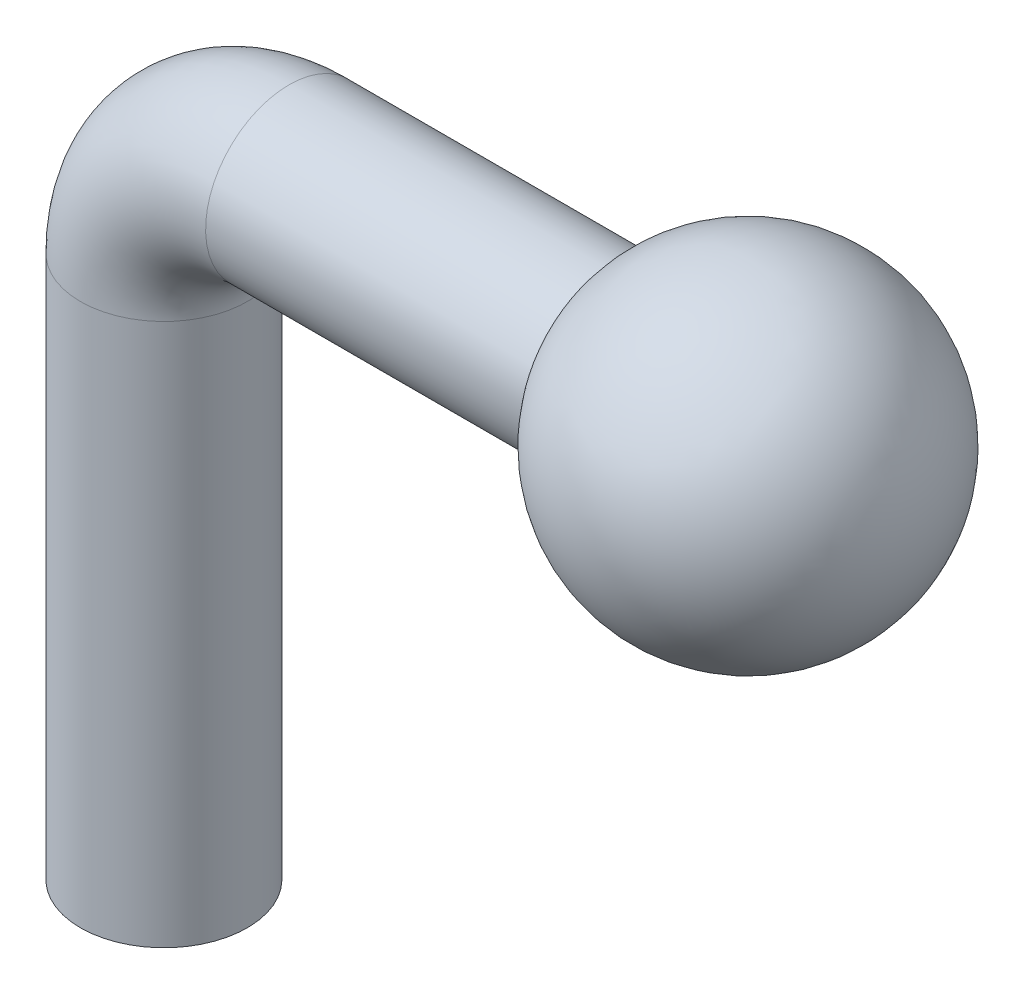
ISO-10303-21;
HEADER;
FILE_DESCRIPTION(('STEP AP214'),'2;1');
FILE_NAME('part.step','',(''),(''),'','','');
FILE_SCHEMA(('AUTOMOTIVE_DESIGN { 1 0 10303 214 1 1 1 1 }'));
ENDSEC;
DATA;
#1=APPLICATION_CONTEXT('core data for automotive mechanical design processes');
#2=APPLICATION_PROTOCOL_DEFINITION('international standard','automotive_design',2000,#1);
#3=PRODUCT_CONTEXT('',#1,'mechanical');
#4=PRODUCT('Part','Part','',(#3));
#5=PRODUCT_RELATED_PRODUCT_CATEGORY('part','',(#4));
#6=PRODUCT_DEFINITION_FORMATION('','',#4);
#7=PRODUCT_DEFINITION_CONTEXT('part definition',#1,'design');
#8=PRODUCT_DEFINITION('design','',#6,#7);
#9=PRODUCT_DEFINITION_SHAPE('','',#8);
#10=(LENGTH_UNIT() NAMED_UNIT(*) SI_UNIT(.MILLI.,.METRE.));
#11=(NAMED_UNIT(*) PLANE_ANGLE_UNIT() SI_UNIT($,.RADIAN.));
#12=(NAMED_UNIT(*) SI_UNIT($,.STERADIAN.) SOLID_ANGLE_UNIT());
#13=UNCERTAINTY_MEASURE_WITH_UNIT(LENGTH_MEASURE(1.E-05),#10,'distance_accuracy_value','');
#14=(GEOMETRIC_REPRESENTATION_CONTEXT(3) GLOBAL_UNCERTAINTY_ASSIGNED_CONTEXT((#13)) GLOBAL_UNIT_ASSIGNED_CONTEXT((#10,
#11,#12)) REPRESENTATION_CONTEXT('',''));
#15=CARTESIAN_POINT('',(0.,0.,0.));
#16=DIRECTION('',(0.,0.,1.));
#17=DIRECTION('',(1.,0.,0.));
#18=AXIS2_PLACEMENT_3D('',#15,#16,#17);
#19=CARTESIAN_POINT('',(3.00000000000002,16.,0.));
#20=DIRECTION('',(1.,0.,0.));
#21=DIRECTION('',(0.,0.,-1.));
#22=AXIS2_PLACEMENT_3D('',#19,#20,#21);
#23=CYLINDRICAL_SURFACE('',#22,2.);
#24=CARTESIAN_POINT('',(3.00000000000002,16.,0.));
#25=DIRECTION('',(1.,0.,0.));
#26=DIRECTION('',(0.,0.,1.));
#27=AXIS2_PLACEMENT_3D('',#24,#25,#26);
#28=CIRCLE('',#27,2.);
#29=CARTESIAN_POINT('',(3.00000000000004,18.,0.));
#30=VERTEX_POINT('',#29);
#31=EDGE_CURVE('E10',#30,#30,#28,.T.);
#32=ORIENTED_EDGE('',*,*,#31,.T.);
#33=EDGE_LOOP('',(#32));
#34=FACE_BOUND('',#33,.T.);
#35=CARTESIAN_POINT('',(10.6518661914434,16.,0.));
#36=DIRECTION('',(1.,0.,0.));
#37=DIRECTION('',(0.,0.,-1.));
#38=AXIS2_PLACEMENT_3D('',#35,#36,#37);
#39=CIRCLE('',#38,2.);
#40=CARTESIAN_POINT('',(10.6518661914434,16.,-2.));
#41=VERTEX_POINT('',#40);
#42=EDGE_CURVE('E49',#41,#41,#39,.F.);
#43=ORIENTED_EDGE('',*,*,#42,.T.);
#44=EDGE_LOOP('',(#43));
#45=FACE_BOUND('',#44,.T.);
#46=ADVANCED_FACE('F45',(#34,#45),#23,.T.);
#47=CARTESIAN_POINT('',(0.,0.,0.));
#48=DIRECTION('',(0.,1.,0.));
#49=DIRECTION('',(0.,0.,1.));
#50=AXIS2_PLACEMENT_3D('',#47,#48,#49);
#51=PLANE('',#50);
#52=CARTESIAN_POINT('',(0.,0.,0.));
#53=DIRECTION('',(0.,1.,0.));
#54=DIRECTION('',(0.,0.,1.));
#55=AXIS2_PLACEMENT_3D('',#52,#53,#54);
#56=CIRCLE('',#55,2.);
#57=CARTESIAN_POINT('',(0.,0.,2.));
#58=VERTEX_POINT('',#57);
#59=EDGE_CURVE('E59',#58,#58,#56,.T.);
#60=ORIENTED_EDGE('',*,*,#59,.F.);
#61=EDGE_LOOP('',(#60));
#62=FACE_BOUND('',#61,.T.);
#63=ADVANCED_FACE('F47',(#62),#51,.F.);
#64=CARTESIAN_POINT('',(0.,0.,0.));
#65=DIRECTION('',(0.,1.,0.));
#66=DIRECTION('',(0.,0.,1.));
#67=AXIS2_PLACEMENT_3D('',#64,#65,#66);
#68=CYLINDRICAL_SURFACE('',#67,2.);
#69=CARTESIAN_POINT('',(0.,13.,0.));
#70=DIRECTION('',(0.,1.,0.));
#71=DIRECTION('',(0.,0.,1.));
#72=AXIS2_PLACEMENT_3D('',#69,#70,#71);
#73=CIRCLE('',#72,2.);
#74=CARTESIAN_POINT('',(-2.,13.,0.));
#75=VERTEX_POINT('',#74);
#76=EDGE_CURVE('E54',#75,#75,#73,.T.);
#77=ORIENTED_EDGE('',*,*,#76,.F.);
#78=EDGE_LOOP('',(#77));
#79=FACE_BOUND('',#78,.T.);
#80=ORIENTED_EDGE('',*,*,#59,.T.);
#81=EDGE_LOOP('',(#80));
#82=FACE_BOUND('',#81,.T.);
#83=ADVANCED_FACE('F79',(#79,#82),#68,.T.);
#84=CARTESIAN_POINT('',(3.,13.,0.));
#85=DIRECTION('',(0.,0.,-1.));
#86=DIRECTION('',(-1.,0.,0.));
#87=AXIS2_PLACEMENT_3D('',#84,#85,#86);
#88=TOROIDAL_SURFACE('',#87,3.,2.);
#89=CARTESIAN_POINT('',(3.,13.,0.));
#90=DIRECTION('',(0.,0.,-1.));
#91=DIRECTION('',(-1.,0.,0.));
#92=AXIS2_PLACEMENT_3D('',#89,#90,#91);
#93=CIRCLE('',#92,5.);
#94=EDGE_CURVE('',#75,#30,#93,.T.);
#95=ORIENTED_EDGE('',*,*,#76,.T.);
#96=ORIENTED_EDGE('',*,*,#31,.F.);
#97=ORIENTED_EDGE('',*,*,#94,.T.);
#98=ORIENTED_EDGE('',*,*,#94,.F.);
#99=EDGE_LOOP('',(#95,#97,#96,#98));
#100=FACE_BOUND('',#99,.T.);
#101=ADVANCED_FACE('F73',(#100),#88,.T.);
#102=CARTESIAN_POINT('',(14.,16.,0.));
#103=DIRECTION('',(-1.,0.,0.));
#104=DIRECTION('',(0.,1.,0.));
#105=AXIS2_PLACEMENT_3D('',#102,#103,#104);
#106=SPHERICAL_SURFACE('',#105,3.9);
#107=ORIENTED_EDGE('',*,*,#42,.F.);
#108=EDGE_LOOP('',(#107));
#109=FACE_BOUND('',#108,.T.);
#110=ADVANCED_FACE('F71',(#109),#106,.T.);
#111=CLOSED_SHELL('',(#46,#63,#83,#101,#110));
#112=MANIFOLD_SOLID_BREP('B2',#111);
#113=ADVANCED_BREP_SHAPE_REPRESENTATION('',(#18,#112),#14);
#114=SHAPE_DEFINITION_REPRESENTATION(#9,#113);
ENDSEC;
END-ISO-10303-21;
